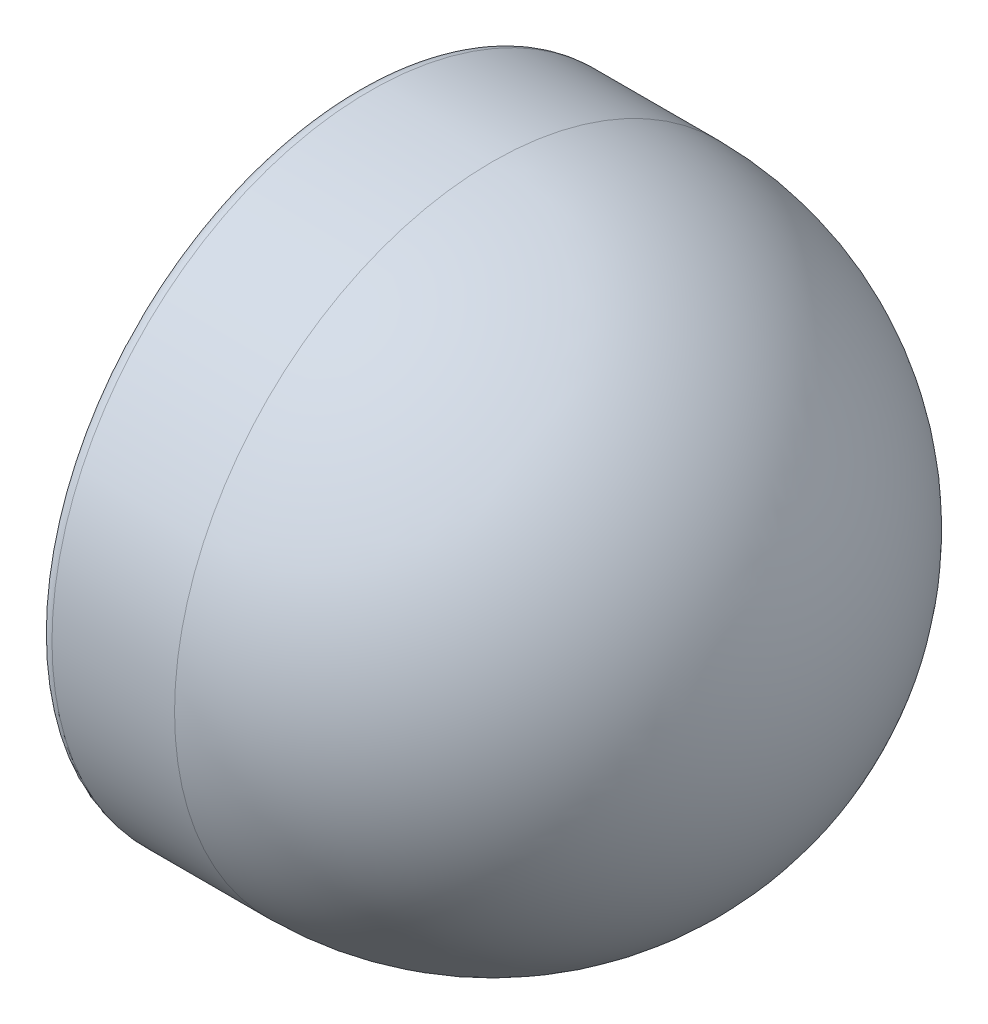
ISO-10303-21;
HEADER;
FILE_DESCRIPTION(('STEP AP214'),'2;1');
FILE_NAME('part.step','',(''),(''),'','','');
FILE_SCHEMA(('AUTOMOTIVE_DESIGN { 1 0 10303 214 1 1 1 1 }'));
ENDSEC;
DATA;
#1=APPLICATION_CONTEXT('core data for automotive mechanical design processes');
#2=APPLICATION_PROTOCOL_DEFINITION('international standard','automotive_design',2000,#1);
#3=PRODUCT_CONTEXT('',#1,'mechanical');
#4=PRODUCT('Part','Part','',(#3));
#5=PRODUCT_RELATED_PRODUCT_CATEGORY('part','',(#4));
#6=PRODUCT_DEFINITION_FORMATION('','',#4);
#7=PRODUCT_DEFINITION_CONTEXT('part definition',#1,'design');
#8=PRODUCT_DEFINITION('design','',#6,#7);
#9=PRODUCT_DEFINITION_SHAPE('','',#8);
#10=(LENGTH_UNIT() NAMED_UNIT(*) SI_UNIT(.MILLI.,.METRE.));
#11=(NAMED_UNIT(*) PLANE_ANGLE_UNIT() SI_UNIT($,.RADIAN.));
#12=(NAMED_UNIT(*) SI_UNIT($,.STERADIAN.) SOLID_ANGLE_UNIT());
#13=UNCERTAINTY_MEASURE_WITH_UNIT(LENGTH_MEASURE(1.E-05),#10,'distance_accuracy_value','');
#14=(GEOMETRIC_REPRESENTATION_CONTEXT(3) GLOBAL_UNCERTAINTY_ASSIGNED_CONTEXT((#13)) GLOBAL_UNIT_ASSIGNED_CONTEXT((#10,
#11,#12)) REPRESENTATION_CONTEXT('',''));
#15=CARTESIAN_POINT('',(0.,0.,0.));
#16=DIRECTION('',(0.,0.,1.));
#17=DIRECTION('',(1.,0.,0.));
#18=AXIS2_PLACEMENT_3D('',#15,#16,#17);
#19=CARTESIAN_POINT('',(-70.,0.,0.));
#20=DIRECTION('',(-1.,0.,0.));
#21=DIRECTION('',(0.,1.,0.));
#22=AXIS2_PLACEMENT_3D('',#19,#20,#21);
#23=SPHERICAL_SURFACE('',#22,70.);
#24=CARTESIAN_POINT('',(-70.,0.,0.));
#25=DIRECTION('',(-1.,0.,0.));
#26=DIRECTION('',(0.,0.,1.));
#27=AXIS2_PLACEMENT_3D('',#24,#25,#26);
#28=CIRCLE('',#27,70.);
#29=CARTESIAN_POINT('',(-70.,0.,70.));
#30=VERTEX_POINT('',#29);
#31=EDGE_CURVE('E10',#30,#30,#28,.T.);
#32=ORIENTED_EDGE('',*,*,#31,.F.);
#33=EDGE_LOOP('',(#32));
#34=FACE_BOUND('',#33,.T.);
#35=ADVANCED_FACE('F41',(#34),#23,.T.);
#36=CARTESIAN_POINT('',(-70.,0.,0.));
#37=DIRECTION('',(-1.,0.,0.));
#38=DIRECTION('',(0.,0.,1.));
#39=AXIS2_PLACEMENT_3D('',#36,#37,#38);
#40=CYLINDRICAL_SURFACE('',#39,70.);
#41=CARTESIAN_POINT('',(-97.,0.,0.));
#42=DIRECTION('',(-1.,0.,0.));
#43=DIRECTION('',(0.,0.,1.));
#44=AXIS2_PLACEMENT_3D('',#41,#42,#43);
#45=CIRCLE('',#44,70.);
#46=CARTESIAN_POINT('',(-97.,0.,70.));
#47=VERTEX_POINT('',#46);
#48=EDGE_CURVE('E48',#47,#47,#45,.T.);
#49=ORIENTED_EDGE('',*,*,#48,.F.);
#50=EDGE_LOOP('',(#49));
#51=FACE_BOUND('',#50,.T.);
#52=ORIENTED_EDGE('',*,*,#31,.T.);
#53=EDGE_LOOP('',(#52));
#54=FACE_BOUND('',#53,.T.);
#55=ADVANCED_FACE('F195',(#51,#54),#40,.T.);
#56=CARTESIAN_POINT('',(-97.,0.,0.));
#57=DIRECTION('',(-1.,0.,0.));
#58=DIRECTION('',(0.,0.,1.));
#59=AXIS2_PLACEMENT_3D('',#56,#57,#58);
#60=TOROIDAL_SURFACE('',#59,67.,3.);
#61=CARTESIAN_POINT('',(-100.,0.,0.));
#62=DIRECTION('',(-1.,0.,0.));
#63=DIRECTION('',(0.,0.,1.));
#64=AXIS2_PLACEMENT_3D('',#61,#62,#63);
#65=CIRCLE('',#64,67.);
#66=CARTESIAN_POINT('',(-100.,0.,67.));
#67=VERTEX_POINT('',#66);
#68=EDGE_CURVE('E53',#67,#67,#65,.T.);
#69=ORIENTED_EDGE('',*,*,#68,.F.);
#70=EDGE_LOOP('',(#69));
#71=FACE_BOUND('',#70,.T.);
#72=ORIENTED_EDGE('',*,*,#48,.T.);
#73=EDGE_LOOP('',(#72));
#74=FACE_BOUND('',#73,.T.);
#75=ADVANCED_FACE('F190',(#71,#74),#60,.T.);
#76=CARTESIAN_POINT('',(-100.,67.,0.));
#77=DIRECTION('',(1.,0.,0.));
#78=DIRECTION('',(0.,0.,-1.));
#79=AXIS2_PLACEMENT_3D('',#76,#77,#78);
#80=PLANE('',#79);
#81=CARTESIAN_POINT('',(-100.,0.,0.));
#82=DIRECTION('',(-1.,0.,0.));
#83=DIRECTION('',(0.,0.,1.));
#84=AXIS2_PLACEMENT_3D('',#81,#82,#83);
#85=CIRCLE('',#84,61.5);
#86=CARTESIAN_POINT('',(-100.,0.,61.5));
#87=VERTEX_POINT('',#86);
#88=EDGE_CURVE('E58',#87,#87,#85,.T.);
#89=ORIENTED_EDGE('',*,*,#88,.F.);
#90=EDGE_LOOP('',(#89));
#91=FACE_BOUND('',#90,.T.);
#92=ORIENTED_EDGE('',*,*,#68,.T.);
#93=EDGE_LOOP('',(#92));
#94=FACE_BOUND('',#93,.T.);
#95=ADVANCED_FACE('F184',(#91,#94),#80,.F.);
#96=CARTESIAN_POINT('',(-98.5,0.,0.));
#97=DIRECTION('',(-1.,0.,0.));
#98=DIRECTION('',(0.,0.,1.));
#99=AXIS2_PLACEMENT_3D('',#96,#97,#98);
#100=TOROIDAL_SURFACE('',#99,61.5,1.5);
#101=CARTESIAN_POINT('',(-98.5,0.,0.));
#102=DIRECTION('',(-1.,0.,0.));
#103=DIRECTION('',(0.,0.,1.));
#104=AXIS2_PLACEMENT_3D('',#101,#102,#103);
#105=CIRCLE('',#104,60.);
#106=CARTESIAN_POINT('',(-98.5,0.,60.));
#107=VERTEX_POINT('',#106);
#108=EDGE_CURVE('E64',#107,#107,#105,.T.);
#109=ORIENTED_EDGE('',*,*,#108,.F.);
#110=EDGE_LOOP('',(#109));
#111=FACE_BOUND('',#110,.T.);
#112=ORIENTED_EDGE('',*,*,#88,.T.);
#113=EDGE_LOOP('',(#112));
#114=FACE_BOUND('',#113,.T.);
#115=ADVANCED_FACE('F178',(#111,#114),#100,.T.);
#116=CARTESIAN_POINT('',(-70.,0.,0.));
#117=DIRECTION('',(-1.,0.,0.));
#118=DIRECTION('',(0.,0.,1.));
#119=AXIS2_PLACEMENT_3D('',#116,#117,#118);
#120=CYLINDRICAL_SURFACE('',#119,60.);
#121=CARTESIAN_POINT('',(-96.6213203435597,0.,0.));
#122=DIRECTION('',(-1.,0.,0.));
#123=DIRECTION('',(0.,0.,1.));
#124=AXIS2_PLACEMENT_3D('',#121,#122,#123);
#125=CIRCLE('',#124,60.);
#126=CARTESIAN_POINT('',(-96.6213203435597,0.,60.));
#127=VERTEX_POINT('',#126);
#128=EDGE_CURVE('E68',#127,#127,#125,.T.);
#129=ORIENTED_EDGE('',*,*,#128,.F.);
#130=EDGE_LOOP('',(#129));
#131=FACE_BOUND('',#130,.T.);
#132=ORIENTED_EDGE('',*,*,#108,.T.);
#133=EDGE_LOOP('',(#132));
#134=FACE_BOUND('',#133,.T.);
#135=ADVANCED_FACE('F172',(#131,#134),#120,.F.);
#136=CARTESIAN_POINT('',(-96.6213203435597,0.,0.));
#137=DIRECTION('',(-1.,0.,0.));
#138=DIRECTION('',(0.,0.,1.));
#139=AXIS2_PLACEMENT_3D('',#136,#137,#138);
#140=TOROIDAL_SURFACE('',#139,61.5,1.5);
#141=CARTESIAN_POINT('',(-95.5606601717798,0.,0.));
#142=DIRECTION('',(-1.,0.,0.));
#143=DIRECTION('',(0.,0.,1.));
#144=AXIS2_PLACEMENT_3D('',#141,#142,#143);
#145=CIRCLE('',#144,60.4393398282202);
#146=CARTESIAN_POINT('',(-95.5606601717798,0.,60.4393398282202));
#147=VERTEX_POINT('',#146);
#148=EDGE_CURVE('E72',#147,#147,#145,.T.);
#149=ORIENTED_EDGE('',*,*,#148,.F.);
#150=EDGE_LOOP('',(#149));
#151=FACE_BOUND('',#150,.T.);
#152=ORIENTED_EDGE('',*,*,#128,.T.);
#153=EDGE_LOOP('',(#152));
#154=FACE_BOUND('',#153,.T.);
#155=ADVANCED_FACE('F166',(#151,#154),#140,.T.);
#156=CARTESIAN_POINT('',(-95.5606601717798,0.,0.));
#157=DIRECTION('',(1.,0.,0.));
#158=DIRECTION('',(0.,0.,-1.));
#159=AXIS2_PLACEMENT_3D('',#156,#157,#158);
#160=CONICAL_SURFACE('',#159,60.4393398282202,0.785398163397447);
#161=CARTESIAN_POINT('',(-92.4838349527889,0.,0.));
#162=DIRECTION('',(-1.,0.,0.));
#163=DIRECTION('',(0.,0.,1.));
#164=AXIS2_PLACEMENT_3D('',#161,#162,#163);
#165=CIRCLE('',#164,63.5161650472111);
#166=CARTESIAN_POINT('',(-92.4838349527889,0.,63.5161650472111));
#167=VERTEX_POINT('',#166);
#168=EDGE_CURVE('E76',#167,#167,#165,.T.);
#169=ORIENTED_EDGE('',*,*,#168,.F.);
#170=EDGE_LOOP('',(#169));
#171=FACE_BOUND('',#170,.T.);
#172=ORIENTED_EDGE('',*,*,#148,.T.);
#173=EDGE_LOOP('',(#172));
#174=FACE_BOUND('',#173,.T.);
#175=ADVANCED_FACE('F160',(#171,#174),#160,.F.);
#176=CARTESIAN_POINT('',(-92.4838349527889,0.,0.));
#177=DIRECTION('',(-1.,0.,0.));
#178=DIRECTION('',(0.,0.,1.));
#179=AXIS2_PLACEMENT_3D('',#176,#177,#178);
#180=CONICAL_SURFACE('',#179,63.5161650472111,0.785398163397448);
#181=CARTESIAN_POINT('',(-93.1909417339754,0.,0.));
#182=DIRECTION('',(-1.,0.,0.));
#183=DIRECTION('',(0.,0.,1.));
#184=AXIS2_PLACEMENT_3D('',#181,#182,#183);
#185=CIRCLE('',#184,64.2232718283977);
#186=CARTESIAN_POINT('',(-93.1909417339754,0.,64.2232718283977));
#187=VERTEX_POINT('',#186);
#188=EDGE_CURVE('E80',#187,#187,#185,.T.);
#189=ORIENTED_EDGE('',*,*,#188,.F.);
#190=EDGE_LOOP('',(#189));
#191=FACE_BOUND('',#190,.T.);
#192=ORIENTED_EDGE('',*,*,#168,.T.);
#193=EDGE_LOOP('',(#192));
#194=FACE_BOUND('',#193,.T.);
#195=ADVANCED_FACE('F154',(#191,#194),#180,.T.);
#196=CARTESIAN_POINT('',(-93.1909417339754,0.,0.));
#197=DIRECTION('',(1.,0.,0.));
#198=DIRECTION('',(0.,0.,-1.));
#199=AXIS2_PLACEMENT_3D('',#196,#197,#198);
#200=CONICAL_SURFACE('',#199,64.2232718283977,0.785398163397445);
#201=CARTESIAN_POINT('',(-96.2677669529664,0.,0.));
#202=DIRECTION('',(-1.,0.,0.));
#203=DIRECTION('',(0.,0.,1.));
#204=AXIS2_PLACEMENT_3D('',#201,#202,#203);
#205=CIRCLE('',#204,61.1464466094067);
#206=CARTESIAN_POINT('',(-96.2677669529664,0.,61.1464466094067));
#207=VERTEX_POINT('',#206);
#208=EDGE_CURVE('E84',#207,#207,#205,.T.);
#209=ORIENTED_EDGE('',*,*,#208,.F.);
#210=EDGE_LOOP('',(#209));
#211=FACE_BOUND('',#210,.T.);
#212=ORIENTED_EDGE('',*,*,#188,.T.);
#213=EDGE_LOOP('',(#212));
#214=FACE_BOUND('',#213,.T.);
#215=ADVANCED_FACE('F148',(#211,#214),#200,.T.);
#216=CARTESIAN_POINT('',(-96.6213203435597,0.,0.));
#217=DIRECTION('',(-1.,0.,0.));
#218=DIRECTION('',(0.,0.,1.));
#219=AXIS2_PLACEMENT_3D('',#216,#217,#218);
#220=TOROIDAL_SURFACE('',#219,61.5,0.499999999999999);
#221=CARTESIAN_POINT('',(-96.6213203435597,0.,0.));
#222=DIRECTION('',(-1.,0.,0.));
#223=DIRECTION('',(0.,0.,1.));
#224=AXIS2_PLACEMENT_3D('',#221,#222,#223);
#225=CIRCLE('',#224,61.);
#226=CARTESIAN_POINT('',(-96.6213203435597,0.,61.));
#227=VERTEX_POINT('',#226);
#228=EDGE_CURVE('E88',#227,#227,#225,.T.);
#229=ORIENTED_EDGE('',*,*,#228,.F.);
#230=EDGE_LOOP('',(#229));
#231=FACE_BOUND('',#230,.T.);
#232=ORIENTED_EDGE('',*,*,#208,.T.);
#233=EDGE_LOOP('',(#232));
#234=FACE_BOUND('',#233,.T.);
#235=ADVANCED_FACE('F142',(#231,#234),#220,.F.);
#236=CARTESIAN_POINT('',(-70.,0.,0.));
#237=DIRECTION('',(-1.,0.,0.));
#238=DIRECTION('',(0.,0.,1.));
#239=AXIS2_PLACEMENT_3D('',#236,#237,#238);
#240=CYLINDRICAL_SURFACE('',#239,61.);
#241=CARTESIAN_POINT('',(-98.5,0.,0.));
#242=DIRECTION('',(-1.,0.,0.));
#243=DIRECTION('',(0.,0.,1.));
#244=AXIS2_PLACEMENT_3D('',#241,#242,#243);
#245=CIRCLE('',#244,61.);
#246=CARTESIAN_POINT('',(-98.5,0.,61.));
#247=VERTEX_POINT('',#246);
#248=EDGE_CURVE('E92',#247,#247,#245,.T.);
#249=ORIENTED_EDGE('',*,*,#248,.F.);
#250=EDGE_LOOP('',(#249));
#251=FACE_BOUND('',#250,.T.);
#252=ORIENTED_EDGE('',*,*,#228,.T.);
#253=EDGE_LOOP('',(#252));
#254=FACE_BOUND('',#253,.T.);
#255=ADVANCED_FACE('F136',(#251,#254),#240,.T.);
#256=CARTESIAN_POINT('',(-98.5,0.,0.));
#257=DIRECTION('',(-1.,0.,0.));
#258=DIRECTION('',(0.,0.,1.));
#259=AXIS2_PLACEMENT_3D('',#256,#257,#258);
#260=TOROIDAL_SURFACE('',#259,61.5,0.5);
#261=CARTESIAN_POINT('',(-99.,0.,0.));
#262=DIRECTION('',(-1.,0.,0.));
#263=DIRECTION('',(0.,0.,1.));
#264=AXIS2_PLACEMENT_3D('',#261,#262,#263);
#265=CIRCLE('',#264,61.5);
#266=CARTESIAN_POINT('',(-99.,0.,61.5));
#267=VERTEX_POINT('',#266);
#268=EDGE_CURVE('E96',#267,#267,#265,.T.);
#269=ORIENTED_EDGE('',*,*,#268,.F.);
#270=EDGE_LOOP('',(#269));
#271=FACE_BOUND('',#270,.T.);
#272=ORIENTED_EDGE('',*,*,#248,.T.);
#273=EDGE_LOOP('',(#272));
#274=FACE_BOUND('',#273,.T.);
#275=ADVANCED_FACE('F130',(#271,#274),#260,.F.);
#276=CARTESIAN_POINT('',(-99.,67.,0.));
#277=DIRECTION('',(-1.,0.,0.));
#278=DIRECTION('',(0.,0.,1.));
#279=AXIS2_PLACEMENT_3D('',#276,#277,#278);
#280=PLANE('',#279);
#281=CARTESIAN_POINT('',(-99.,0.,0.));
#282=DIRECTION('',(-1.,0.,0.));
#283=DIRECTION('',(0.,0.,1.));
#284=AXIS2_PLACEMENT_3D('',#281,#282,#283);
#285=CIRCLE('',#284,67.);
#286=CARTESIAN_POINT('',(-99.,0.,67.));
#287=VERTEX_POINT('',#286);
#288=EDGE_CURVE('E100',#287,#287,#285,.T.);
#289=ORIENTED_EDGE('',*,*,#288,.F.);
#290=EDGE_LOOP('',(#289));
#291=FACE_BOUND('',#290,.T.);
#292=ORIENTED_EDGE('',*,*,#268,.T.);
#293=EDGE_LOOP('',(#292));
#294=FACE_BOUND('',#293,.T.);
#295=ADVANCED_FACE('F124',(#291,#294),#280,.F.);
#296=CARTESIAN_POINT('',(-97.,0.,0.));
#297=DIRECTION('',(-1.,0.,0.));
#298=DIRECTION('',(0.,0.,1.));
#299=AXIS2_PLACEMENT_3D('',#296,#297,#298);
#300=TOROIDAL_SURFACE('',#299,67.,2.);
#301=CARTESIAN_POINT('',(-97.,0.,0.));
#302=DIRECTION('',(-1.,0.,0.));
#303=DIRECTION('',(0.,0.,1.));
#304=AXIS2_PLACEMENT_3D('',#301,#302,#303);
#305=CIRCLE('',#304,69.);
#306=CARTESIAN_POINT('',(-97.,0.,69.));
#307=VERTEX_POINT('',#306);
#308=EDGE_CURVE('E104',#307,#307,#305,.T.);
#309=ORIENTED_EDGE('',*,*,#308,.F.);
#310=EDGE_LOOP('',(#309));
#311=FACE_BOUND('',#310,.T.);
#312=ORIENTED_EDGE('',*,*,#288,.T.);
#313=EDGE_LOOP('',(#312));
#314=FACE_BOUND('',#313,.T.);
#315=ADVANCED_FACE('F118',(#311,#314),#300,.F.);
#316=CARTESIAN_POINT('',(-70.,0.,0.));
#317=DIRECTION('',(-1.,0.,0.));
#318=DIRECTION('',(0.,0.,1.));
#319=AXIS2_PLACEMENT_3D('',#316,#317,#318);
#320=CYLINDRICAL_SURFACE('',#319,69.);
#321=CARTESIAN_POINT('',(-70.,0.,0.));
#322=DIRECTION('',(-1.,0.,0.));
#323=DIRECTION('',(0.,0.,1.));
#324=AXIS2_PLACEMENT_3D('',#321,#322,#323);
#325=CIRCLE('',#324,69.);
#326=CARTESIAN_POINT('',(-70.,0.,69.));
#327=VERTEX_POINT('',#326);
#328=EDGE_CURVE('E108',#327,#327,#325,.T.);
#329=ORIENTED_EDGE('',*,*,#328,.F.);
#330=EDGE_LOOP('',(#329));
#331=FACE_BOUND('',#330,.T.);
#332=ORIENTED_EDGE('',*,*,#308,.T.);
#333=EDGE_LOOP('',(#332));
#334=FACE_BOUND('',#333,.T.);
#335=ADVANCED_FACE('F115',(#331,#334),#320,.F.);
#336=CARTESIAN_POINT('',(-70.,0.,0.));
#337=DIRECTION('',(-1.,0.,0.));
#338=DIRECTION('',(0.,1.,0.));
#339=AXIS2_PLACEMENT_3D('',#336,#337,#338);
#340=SPHERICAL_SURFACE('',#339,69.);
#341=ORIENTED_EDGE('',*,*,#328,.T.);
#342=EDGE_LOOP('',(#341));
#343=FACE_BOUND('',#342,.T.);
#344=ADVANCED_FACE('F113',(#343),#340,.F.);
#345=CLOSED_SHELL('',(#35,#55,#75,#95,#115,#135,#155,#175,#195,#215,#235,#255,#275,#295,#315,
#335,#344));
#346=MANIFOLD_SOLID_BREP('B2',#345);
#347=ADVANCED_BREP_SHAPE_REPRESENTATION('',(#18,#346),#14);
#348=SHAPE_DEFINITION_REPRESENTATION(#9,#347);
ENDSEC;
END-ISO-10303-21;
